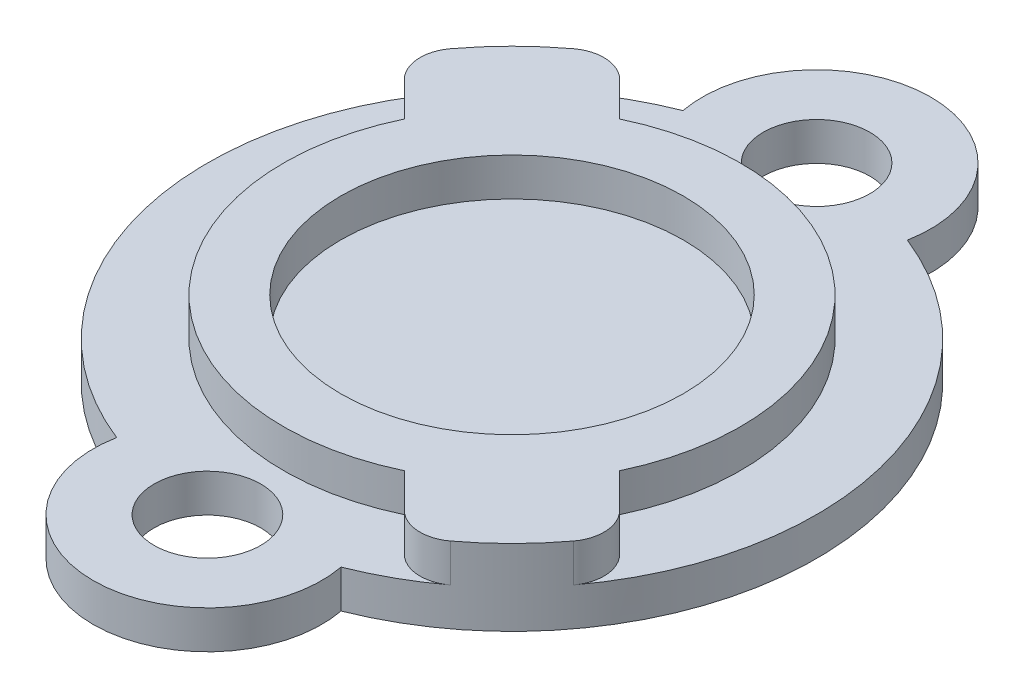
ISO-10303-21;
HEADER;
FILE_DESCRIPTION(('STEP AP214'),'2;1');
FILE_NAME('part.step','',(''),(''),'','','');
FILE_SCHEMA(('AUTOMOTIVE_DESIGN { 1 0 10303 214 1 1 1 1 }'));
ENDSEC;
DATA;
#1=APPLICATION_CONTEXT('core data for automotive mechanical design processes');
#2=APPLICATION_PROTOCOL_DEFINITION('international standard','automotive_design',2000,#1);
#3=PRODUCT_CONTEXT('',#1,'mechanical');
#4=PRODUCT('Part','Part','',(#3));
#5=PRODUCT_RELATED_PRODUCT_CATEGORY('part','',(#4));
#6=PRODUCT_DEFINITION_FORMATION('','',#4);
#7=PRODUCT_DEFINITION_CONTEXT('part definition',#1,'design');
#8=PRODUCT_DEFINITION('design','',#6,#7);
#9=PRODUCT_DEFINITION_SHAPE('','',#8);
#10=(LENGTH_UNIT() NAMED_UNIT(*) SI_UNIT(.MILLI.,.METRE.));
#11=(NAMED_UNIT(*) PLANE_ANGLE_UNIT() SI_UNIT($,.RADIAN.));
#12=(NAMED_UNIT(*) SI_UNIT($,.STERADIAN.) SOLID_ANGLE_UNIT());
#13=UNCERTAINTY_MEASURE_WITH_UNIT(LENGTH_MEASURE(1.E-05),#10,'distance_accuracy_value','');
#14=(GEOMETRIC_REPRESENTATION_CONTEXT(3) GLOBAL_UNCERTAINTY_ASSIGNED_CONTEXT((#13)) GLOBAL_UNIT_ASSIGNED_CONTEXT((#10,
#11,#12)) REPRESENTATION_CONTEXT('',''));
#15=CARTESIAN_POINT('',(0.,0.,0.));
#16=DIRECTION('',(0.,0.,1.));
#17=DIRECTION('',(1.,0.,0.));
#18=AXIS2_PLACEMENT_3D('',#15,#16,#17);
#19=CARTESIAN_POINT('',(-5.6060862667529,0.,-4.19187270437981));
#20=DIRECTION('',(0.,1.,0.));
#21=DIRECTION('',(-0.997432533711125,0.,0.0716124339385723));
#22=AXIS2_PLACEMENT_3D('',#19,#20,#21);
#23=CYLINDRICAL_SURFACE('',#22,1.);
#24=CARTESIAN_POINT('',(-5.6060862667529,2.,-4.19187270437981));
#25=DIRECTION('',(0.,-1.,0.));
#26=DIRECTION('',(-0.997432533711125,0.,0.0716124339385723));
#27=AXIS2_PLACEMENT_3D('',#24,#25,#26);
#28=CIRCLE('',#27,1.);
#29=CARTESIAN_POINT('',(-6.31319304793945,2.,-3.48476592319326));
#30=VERTEX_POINT('',#29);
#31=CARTESIAN_POINT('',(-6.40695573343189,2.,-4.79071166214835));
#32=VERTEX_POINT('',#31);
#33=EDGE_CURVE('E11',#30,#32,#28,.T.);
#34=ORIENTED_EDGE('',*,*,#33,.T.);
#35=DIRECTION('',(0.,-1.,0.));
#36=VECTOR('',#35,1.);
#37=CARTESIAN_POINT('',(-6.40695573343189,0.,-4.79071166214835));
#38=LINE('',#37,#36);
#39=CARTESIAN_POINT('',(-6.40695573343189,1.,-4.79071166214835));
#40=VERTEX_POINT('',#39);
#41=EDGE_CURVE('E28',#32,#40,#38,.T.);
#42=ORIENTED_EDGE('',*,*,#41,.T.);
#43=CARTESIAN_POINT('',(-5.6060862667529,1.,-4.19187270437981));
#44=DIRECTION('',(0.,1.,0.));
#45=DIRECTION('',(-0.997432533711125,0.,0.0716124339385723));
#46=AXIS2_PLACEMENT_3D('',#43,#44,#45);
#47=CIRCLE('',#46,1.);
#48=CARTESIAN_POINT('',(-6.31319304793945,1.,-3.48476592319326));
#49=VERTEX_POINT('',#48);
#50=EDGE_CURVE('E203',#40,#49,#47,.T.);
#51=ORIENTED_EDGE('',*,*,#50,.T.);
#52=DIRECTION('',(0.,1.,0.));
#53=VECTOR('',#52,1.);
#54=CARTESIAN_POINT('',(-6.31319304793945,0.,-3.48476592319326));
#55=LINE('',#54,#53);
#56=EDGE_CURVE('E283',#49,#30,#55,.T.);
#57=ORIENTED_EDGE('',*,*,#56,.T.);
#58=EDGE_LOOP('',(#34,#42,#51,#57));
#59=FACE_BOUND('',#58,.T.);
#60=ADVANCED_FACE('F17',(#59),#23,.T.);
#61=CARTESIAN_POINT('',(-6.89143913742476,1.,-4.06301201267857));
#62=DIRECTION('',(-0.707106781186547,0.,0.707106781186548));
#63=DIRECTION('',(0.,1.,0.));
#64=AXIS2_PLACEMENT_3D('',#61,#62,#63);
#65=PLANE('',#64);
#66=ORIENTED_EDGE('',*,*,#56,.F.);
#67=DIRECTION('',(-0.707106781186548,0.,-0.707106781186547));
#68=VECTOR('',#67,1.);
#69=CARTESIAN_POINT('',(-4.15282634989892,1.,-1.32439922515274));
#70=LINE('',#69,#68);
#71=CARTESIAN_POINT('',(-5.4142135623731,1.,-2.58578643762691));
#72=VERTEX_POINT('',#71);
#73=EDGE_CURVE('E205',#72,#49,#70,.T.);
#74=ORIENTED_EDGE('',*,*,#73,.F.);
#75=DIRECTION('',(0.,1.,0.));
#76=VECTOR('',#75,1.);
#77=CARTESIAN_POINT('',(-5.4142135623731,1.,-2.58578643762691));
#78=LINE('',#77,#76);
#79=CARTESIAN_POINT('',(-5.4142135623731,2.,-2.58578643762691));
#80=VERTEX_POINT('',#79);
#81=EDGE_CURVE('E21',#72,#80,#78,.T.);
#82=ORIENTED_EDGE('',*,*,#81,.T.);
#83=DIRECTION('',(0.707106781186548,0.,0.707106781186547));
#84=VECTOR('',#83,1.);
#85=CARTESIAN_POINT('',(-7.07106781186548,2.,-4.24264068711929));
#86=LINE('',#85,#84);
#87=EDGE_CURVE('E254',#30,#80,#86,.T.);
#88=ORIENTED_EDGE('',*,*,#87,.F.);
#89=EDGE_LOOP('',(#66,#74,#82,#88));
#90=FACE_BOUND('',#89,.T.);
#91=ADVANCED_FACE('F455',(#90),#65,.T.);
#92=CARTESIAN_POINT('',(-4.19187270437981,0.,-5.60608626675291));
#93=DIRECTION('',(0.,1.,0.));
#94=DIRECTION('',(0.071612433938573,0.,-0.997432533711125));
#95=AXIS2_PLACEMENT_3D('',#92,#93,#94);
#96=CYLINDRICAL_SURFACE('',#95,1.);
#97=CARTESIAN_POINT('',(-4.19187270437981,2.,-5.60608626675291));
#98=DIRECTION('',(0.,-1.,0.));
#99=DIRECTION('',(0.071612433938573,0.,-0.997432533711125));
#100=AXIS2_PLACEMENT_3D('',#97,#98,#99);
#101=CIRCLE('',#100,1.);
#102=CARTESIAN_POINT('',(-4.79071166214835,2.,-6.40695573343189));
#103=VERTEX_POINT('',#102);
#104=CARTESIAN_POINT('',(-3.48476592319326,2.,-6.31319304793945));
#105=VERTEX_POINT('',#104);
#106=EDGE_CURVE('E295',#103,#105,#101,.T.);
#107=ORIENTED_EDGE('',*,*,#106,.T.);
#108=DIRECTION('',(0.,-1.,0.));
#109=VECTOR('',#108,1.);
#110=CARTESIAN_POINT('',(-3.48476592319326,0.,-6.31319304793945));
#111=LINE('',#110,#109);
#112=CARTESIAN_POINT('',(-3.48476592319326,1.,-6.31319304793945));
#113=VERTEX_POINT('',#112);
#114=EDGE_CURVE('E297',#105,#113,#111,.T.);
#115=ORIENTED_EDGE('',*,*,#114,.T.);
#116=CARTESIAN_POINT('',(-4.19187270437981,1.,-5.60608626675291));
#117=DIRECTION('',(0.,1.,0.));
#118=DIRECTION('',(0.071612433938573,0.,-0.997432533711125));
#119=AXIS2_PLACEMENT_3D('',#116,#117,#118);
#120=CIRCLE('',#119,1.);
#121=CARTESIAN_POINT('',(-4.79071166214835,1.,-6.40695573343189));
#122=VERTEX_POINT('',#121);
#123=EDGE_CURVE('E304',#113,#122,#120,.T.);
#124=ORIENTED_EDGE('',*,*,#123,.T.);
#125=DIRECTION('',(0.,1.,0.));
#126=VECTOR('',#125,1.);
#127=CARTESIAN_POINT('',(-4.79071166214835,0.,-6.40695573343189));
#128=LINE('',#127,#126);
#129=EDGE_CURVE('E91',#122,#103,#128,.T.);
#130=ORIENTED_EDGE('',*,*,#129,.T.);
#131=EDGE_LOOP('',(#107,#115,#124,#130));
#132=FACE_BOUND('',#131,.T.);
#133=ADVANCED_FACE('F461',(#132),#96,.T.);
#134=CARTESIAN_POINT('',(0.,0.,0.));
#135=DIRECTION('',(0.,1.,0.));
#136=DIRECTION('',(-1.,0.,0.));
#137=AXIS2_PLACEMENT_3D('',#134,#135,#136);
#138=CYLINDRICAL_SURFACE('',#137,8.);
#139=ORIENTED_EDGE('',*,*,#41,.F.);
#140=CARTESIAN_POINT('',(0.,2.,0.));
#141=DIRECTION('',(0.,1.,0.));
#142=DIRECTION('',(-0.368349226066446,0.,-0.9296875));
#143=AXIS2_PLACEMENT_3D('',#140,#141,#142);
#144=CIRCLE('',#143,8.);
#145=EDGE_CURVE('E506',#103,#32,#144,.T.);
#146=ORIENTED_EDGE('',*,*,#145,.F.);
#147=ORIENTED_EDGE('',*,*,#129,.F.);
#148=CARTESIAN_POINT('',(0.,1.,0.));
#149=DIRECTION('',(0.,1.,0.));
#150=DIRECTION('',(-1.,0.,0.));
#151=AXIS2_PLACEMENT_3D('',#148,#149,#150);
#152=CIRCLE('',#151,8.);
#153=CARTESIAN_POINT('',(-2.94679380853157,1.,-7.4375));
#154=VERTEX_POINT('',#153);
#155=EDGE_CURVE('E280',#154,#122,#152,.T.);
#156=ORIENTED_EDGE('',*,*,#155,.F.);
#157=DIRECTION('',(0.,1.,0.));
#158=VECTOR('',#157,1.);
#159=CARTESIAN_POINT('',(-2.94679380853157,0.,-7.4375));
#160=LINE('',#159,#158);
#161=CARTESIAN_POINT('',(-2.94679380853157,0.,-7.4375));
#162=VERTEX_POINT('',#161);
#163=EDGE_CURVE('E276',#162,#154,#160,.T.);
#164=ORIENTED_EDGE('',*,*,#163,.F.);
#165=CARTESIAN_POINT('',(0.,0.,0.));
#166=DIRECTION('',(0.,1.,0.));
#167=DIRECTION('',(-1.,0.,0.));
#168=AXIS2_PLACEMENT_3D('',#165,#166,#167);
#169=CIRCLE('',#168,8.);
#170=CARTESIAN_POINT('',(-2.94679380853157,0.,7.4375));
#171=VERTEX_POINT('',#170);
#172=EDGE_CURVE('E210',#162,#171,#169,.T.);
#173=ORIENTED_EDGE('',*,*,#172,.T.);
#174=DIRECTION('',(0.,1.,0.));
#175=VECTOR('',#174,1.);
#176=CARTESIAN_POINT('',(-2.94679380853157,0.,7.4375));
#177=LINE('',#176,#175);
#178=CARTESIAN_POINT('',(-2.94679380853157,1.,7.4375));
#179=VERTEX_POINT('',#178);
#180=EDGE_CURVE('E207',#171,#179,#177,.T.);
#181=ORIENTED_EDGE('',*,*,#180,.T.);
#182=CARTESIAN_POINT('',(0.,1.,0.));
#183=DIRECTION('',(0.,1.,0.));
#184=DIRECTION('',(-1.,0.,0.));
#185=AXIS2_PLACEMENT_3D('',#182,#183,#184);
#186=CIRCLE('',#185,8.);
#187=EDGE_CURVE('E195',#40,#179,#186,.T.);
#188=ORIENTED_EDGE('',*,*,#187,.F.);
#189=EDGE_LOOP('',(#139,#146,#147,#156,#164,#173,#181,#188));
#190=FACE_BOUND('',#189,.T.);
#191=ADVANCED_FACE('F208',(#190),#138,.T.);
#192=CARTESIAN_POINT('',(5.60608626675291,0.,4.19187270437981));
#193=DIRECTION('',(0.,1.,0.));
#194=DIRECTION('',(0.997432533711125,0.,-0.0716124339385737));
#195=AXIS2_PLACEMENT_3D('',#192,#193,#194);
#196=CYLINDRICAL_SURFACE('',#195,1.);
#197=CARTESIAN_POINT('',(5.60608626675291,2.,4.19187270437981));
#198=DIRECTION('',(0.,-1.,0.));
#199=DIRECTION('',(0.997432533711125,0.,-0.0716124339385737));
#200=AXIS2_PLACEMENT_3D('',#197,#198,#199);
#201=CIRCLE('',#200,1.);
#202=CARTESIAN_POINT('',(6.31319304793946,2.,3.48476592319326));
#203=VERTEX_POINT('',#202);
#204=CARTESIAN_POINT('',(6.40695573343189,2.,4.79071166214835));
#205=VERTEX_POINT('',#204);
#206=EDGE_CURVE('E215',#203,#205,#201,.T.);
#207=ORIENTED_EDGE('',*,*,#206,.T.);
#208=DIRECTION('',(0.,-1.,0.));
#209=VECTOR('',#208,1.);
#210=CARTESIAN_POINT('',(6.40695573343189,0.,4.79071166214835));
#211=LINE('',#210,#209);
#212=CARTESIAN_POINT('',(6.40695573343189,1.,4.79071166214835));
#213=VERTEX_POINT('',#212);
#214=EDGE_CURVE('E356',#205,#213,#211,.T.);
#215=ORIENTED_EDGE('',*,*,#214,.T.);
#216=CARTESIAN_POINT('',(5.60608626675291,1.,4.19187270437981));
#217=DIRECTION('',(0.,1.,0.));
#218=DIRECTION('',(0.997432533711125,0.,-0.0716124339385737));
#219=AXIS2_PLACEMENT_3D('',#216,#217,#218);
#220=CIRCLE('',#219,1.);
#221=CARTESIAN_POINT('',(6.31319304793946,1.,3.48476592319326));
#222=VERTEX_POINT('',#221);
#223=EDGE_CURVE('E401',#213,#222,#220,.T.);
#224=ORIENTED_EDGE('',*,*,#223,.T.);
#225=DIRECTION('',(0.,1.,0.));
#226=VECTOR('',#225,1.);
#227=CARTESIAN_POINT('',(6.31319304793946,0.,3.48476592319326));
#228=LINE('',#227,#226);
#229=EDGE_CURVE('E368',#222,#203,#228,.T.);
#230=ORIENTED_EDGE('',*,*,#229,.T.);
#231=EDGE_LOOP('',(#207,#215,#224,#230));
#232=FACE_BOUND('',#231,.T.);
#233=ADVANCED_FACE('F403',(#232),#196,.T.);
#234=CARTESIAN_POINT('',(6.89143913742476,1.,4.06301201267856));
#235=DIRECTION('',(0.707106781186547,0.,-0.707106781186548));
#236=DIRECTION('',(0.,-1.,0.));
#237=AXIS2_PLACEMENT_3D('',#234,#235,#236);
#238=PLANE('',#237);
#239=ORIENTED_EDGE('',*,*,#229,.F.);
#240=DIRECTION('',(0.707106781186548,0.,0.707106781186547));
#241=VECTOR('',#240,1.);
#242=CARTESIAN_POINT('',(4.15282634989893,1.,1.32439922515273));
#243=LINE('',#242,#241);
#244=CARTESIAN_POINT('',(5.4142135623731,1.,2.5857864376269));
#245=VERTEX_POINT('',#244);
#246=EDGE_CURVE('E138',#245,#222,#243,.T.);
#247=ORIENTED_EDGE('',*,*,#246,.F.);
#248=DIRECTION('',(0.,1.,0.));
#249=VECTOR('',#248,1.);
#250=CARTESIAN_POINT('',(5.4142135623731,1.,2.5857864376269));
#251=LINE('',#250,#249);
#252=CARTESIAN_POINT('',(5.4142135623731,2.,2.5857864376269));
#253=VERTEX_POINT('',#252);
#254=EDGE_CURVE('E340',#245,#253,#251,.T.);
#255=ORIENTED_EDGE('',*,*,#254,.T.);
#256=DIRECTION('',(-0.707106781186548,0.,-0.707106781186547));
#257=VECTOR('',#256,1.);
#258=CARTESIAN_POINT('',(7.07106781186548,2.,4.24264068711928));
#259=LINE('',#258,#257);
#260=EDGE_CURVE('E153',#203,#253,#259,.T.);
#261=ORIENTED_EDGE('',*,*,#260,.F.);
#262=EDGE_LOOP('',(#239,#247,#255,#261));
#263=FACE_BOUND('',#262,.T.);
#264=ADVANCED_FACE('F404',(#263),#238,.T.);
#265=CARTESIAN_POINT('',(4.19187270437982,0.,5.6060862667529));
#266=DIRECTION('',(0.,1.,0.));
#267=DIRECTION('',(-0.0716124339385737,0.,0.997432533711125));
#268=AXIS2_PLACEMENT_3D('',#265,#266,#267);
#269=CYLINDRICAL_SURFACE('',#268,1.);
#270=CARTESIAN_POINT('',(4.19187270437982,2.,5.6060862667529));
#271=DIRECTION('',(0.,-1.,0.));
#272=DIRECTION('',(-0.0716124339385737,0.,0.997432533711125));
#273=AXIS2_PLACEMENT_3D('',#270,#271,#272);
#274=CIRCLE('',#273,1.);
#275=CARTESIAN_POINT('',(4.79071166214836,2.,6.40695573343188));
#276=VERTEX_POINT('',#275);
#277=CARTESIAN_POINT('',(3.48476592319327,2.,6.31319304793945));
#278=VERTEX_POINT('',#277);
#279=EDGE_CURVE('E315',#276,#278,#274,.T.);
#280=ORIENTED_EDGE('',*,*,#279,.T.);
#281=DIRECTION('',(0.,-1.,0.));
#282=VECTOR('',#281,1.);
#283=CARTESIAN_POINT('',(3.48476592319327,0.,6.31319304793945));
#284=LINE('',#283,#282);
#285=CARTESIAN_POINT('',(3.48476592319327,1.,6.31319304793945));
#286=VERTEX_POINT('',#285);
#287=EDGE_CURVE('E331',#278,#286,#284,.T.);
#288=ORIENTED_EDGE('',*,*,#287,.T.);
#289=CARTESIAN_POINT('',(4.19187270437982,1.,5.6060862667529));
#290=DIRECTION('',(0.,1.,0.));
#291=DIRECTION('',(-0.0716124339385737,0.,0.997432533711125));
#292=AXIS2_PLACEMENT_3D('',#289,#290,#291);
#293=CIRCLE('',#292,1.);
#294=CARTESIAN_POINT('',(4.79071166214836,1.,6.40695573343188));
#295=VERTEX_POINT('',#294);
#296=EDGE_CURVE('E334',#286,#295,#293,.T.);
#297=ORIENTED_EDGE('',*,*,#296,.T.);
#298=DIRECTION('',(0.,1.,0.));
#299=VECTOR('',#298,1.);
#300=CARTESIAN_POINT('',(4.79071166214836,0.,6.40695573343188));
#301=LINE('',#300,#299);
#302=EDGE_CURVE('E342',#295,#276,#301,.T.);
#303=ORIENTED_EDGE('',*,*,#302,.T.);
#304=EDGE_LOOP('',(#280,#288,#297,#303));
#305=FACE_BOUND('',#304,.T.);
#306=ADVANCED_FACE('F392',(#305),#269,.T.);
#307=CARTESIAN_POINT('',(0.,0.,0.));
#308=DIRECTION('',(0.,1.,0.));
#309=DIRECTION('',(1.,0.,0.));
#310=AXIS2_PLACEMENT_3D('',#307,#308,#309);
#311=CYLINDRICAL_SURFACE('',#310,8.);
#312=ORIENTED_EDGE('',*,*,#214,.F.);
#313=CARTESIAN_POINT('',(0.,2.,0.));
#314=DIRECTION('',(0.,1.,0.));
#315=DIRECTION('',(0.368349226066447,0.,0.9296875));
#316=AXIS2_PLACEMENT_3D('',#313,#314,#315);
#317=CIRCLE('',#316,8.);
#318=EDGE_CURVE('E247',#276,#205,#317,.T.);
#319=ORIENTED_EDGE('',*,*,#318,.F.);
#320=ORIENTED_EDGE('',*,*,#302,.F.);
#321=CARTESIAN_POINT('',(0.,1.,0.));
#322=DIRECTION('',(0.,1.,0.));
#323=DIRECTION('',(-1.,0.,0.));
#324=AXIS2_PLACEMENT_3D('',#321,#322,#323);
#325=CIRCLE('',#324,8.);
#326=CARTESIAN_POINT('',(2.94679380853157,1.,7.4375));
#327=VERTEX_POINT('',#326);
#328=EDGE_CURVE('E221',#327,#295,#325,.T.);
#329=ORIENTED_EDGE('',*,*,#328,.F.);
#330=DIRECTION('',(0.,1.,0.));
#331=VECTOR('',#330,1.);
#332=CARTESIAN_POINT('',(2.94679380853157,0.,7.4375));
#333=LINE('',#332,#331);
#334=CARTESIAN_POINT('',(2.94679380853157,0.,7.4375));
#335=VERTEX_POINT('',#334);
#336=EDGE_CURVE('E218',#335,#327,#333,.T.);
#337=ORIENTED_EDGE('',*,*,#336,.F.);
#338=CARTESIAN_POINT('',(0.,0.,0.));
#339=DIRECTION('',(0.,1.,0.));
#340=DIRECTION('',(-1.,0.,0.));
#341=AXIS2_PLACEMENT_3D('',#338,#339,#340);
#342=CIRCLE('',#341,8.);
#343=CARTESIAN_POINT('',(2.94679380853157,0.,-7.4375));
#344=VERTEX_POINT('',#343);
#345=EDGE_CURVE('E330',#335,#344,#342,.T.);
#346=ORIENTED_EDGE('',*,*,#345,.T.);
#347=DIRECTION('',(0.,1.,0.));
#348=VECTOR('',#347,1.);
#349=CARTESIAN_POINT('',(2.94679380853157,0.,-7.4375));
#350=LINE('',#349,#348);
#351=CARTESIAN_POINT('',(2.94679380853157,1.,-7.4375));
#352=VERTEX_POINT('',#351);
#353=EDGE_CURVE('E327',#344,#352,#350,.T.);
#354=ORIENTED_EDGE('',*,*,#353,.T.);
#355=CARTESIAN_POINT('',(0.,1.,0.));
#356=DIRECTION('',(0.,1.,0.));
#357=DIRECTION('',(-1.,0.,0.));
#358=AXIS2_PLACEMENT_3D('',#355,#356,#357);
#359=CIRCLE('',#358,8.);
#360=EDGE_CURVE('E234',#213,#352,#359,.T.);
#361=ORIENTED_EDGE('',*,*,#360,.F.);
#362=EDGE_LOOP('',(#312,#319,#320,#329,#337,#346,#354,#361));
#363=FACE_BOUND('',#362,.T.);
#364=ADVANCED_FACE('F395',(#363),#311,.T.);
#365=CARTESIAN_POINT('',(0.,1.,0.));
#366=DIRECTION('',(0.,1.,0.));
#367=DIRECTION('',(-1.,0.,0.));
#368=AXIS2_PLACEMENT_3D('',#365,#366,#367);
#369=CYLINDRICAL_SURFACE('',#368,4.5);
#370=CARTESIAN_POINT('',(0.,2.,0.));
#371=DIRECTION('',(0.,-1.,0.));
#372=DIRECTION('',(-1.,0.,0.));
#373=AXIS2_PLACEMENT_3D('',#370,#371,#372);
#374=CIRCLE('',#373,4.5);
#375=CARTESIAN_POINT('',(4.5,2.,0.));
#376=VERTEX_POINT('',#375);
#377=EDGE_CURVE('E233',#376,#376,#374,.T.);
#378=ORIENTED_EDGE('',*,*,#377,.F.);
#379=DIRECTION('',(0.,-1.,0.));
#380=VECTOR('',#379,1.);
#381=CARTESIAN_POINT('',(4.5,1.,0.));
#382=LINE('',#381,#380);
#383=CARTESIAN_POINT('',(4.5,1.,0.));
#384=VERTEX_POINT('',#383);
#385=EDGE_CURVE('E323',#376,#384,#382,.T.);
#386=ORIENTED_EDGE('',*,*,#385,.T.);
#387=CARTESIAN_POINT('',(0.,1.,0.));
#388=DIRECTION('',(0.,1.,0.));
#389=DIRECTION('',(-1.,0.,0.));
#390=AXIS2_PLACEMENT_3D('',#387,#388,#389);
#391=CIRCLE('',#390,4.5);
#392=EDGE_CURVE('E239',#384,#384,#391,.T.);
#393=ORIENTED_EDGE('',*,*,#392,.F.);
#394=ORIENTED_EDGE('',*,*,#385,.F.);
#395=EDGE_LOOP('',(#378,#386,#393,#394));
#396=FACE_BOUND('',#395,.T.);
#397=ADVANCED_FACE('F493',(#396),#369,.F.);
#398=CARTESIAN_POINT('',(0.,1.,0.));
#399=DIRECTION('',(0.,1.,0.));
#400=DIRECTION('',(1.,0.,0.));
#401=AXIS2_PLACEMENT_3D('',#398,#399,#400);
#402=CYLINDRICAL_SURFACE('',#401,6.);
#403=CARTESIAN_POINT('',(0.,1.,0.));
#404=DIRECTION('',(0.,-1.,0.));
#405=DIRECTION('',(1.,0.,0.));
#406=AXIS2_PLACEMENT_3D('',#403,#404,#405);
#407=CIRCLE('',#406,6.);
#408=CARTESIAN_POINT('',(-2.58578643762691,1.,-5.4142135623731));
#409=VERTEX_POINT('',#408);
#410=EDGE_CURVE('E294',#409,#245,#407,.T.);
#411=ORIENTED_EDGE('',*,*,#410,.F.);
#412=DIRECTION('',(0.,1.,0.));
#413=VECTOR('',#412,1.);
#414=CARTESIAN_POINT('',(-2.58578643762691,1.,-5.4142135623731));
#415=LINE('',#414,#413);
#416=CARTESIAN_POINT('',(-2.58578643762691,2.,-5.4142135623731));
#417=VERTEX_POINT('',#416);
#418=EDGE_CURVE('E253',#409,#417,#415,.T.);
#419=ORIENTED_EDGE('',*,*,#418,.T.);
#420=CARTESIAN_POINT('',(0.,2.,0.));
#421=DIRECTION('',(0.,1.,0.));
#422=DIRECTION('',(1.,0.,0.));
#423=AXIS2_PLACEMENT_3D('',#420,#421,#422);
#424=CIRCLE('',#423,6.);
#425=EDGE_CURVE('E248',#253,#417,#424,.T.);
#426=ORIENTED_EDGE('',*,*,#425,.F.);
#427=ORIENTED_EDGE('',*,*,#254,.F.);
#428=EDGE_LOOP('',(#411,#419,#426,#427));
#429=FACE_BOUND('',#428,.T.);
#430=ADVANCED_FACE('F409',(#429),#402,.T.);
#431=CARTESIAN_POINT('',(2.58578643762691,1.,5.41421356237309));
#432=DIRECTION('',(-0.707106781186547,0.,0.707106781186548));
#433=DIRECTION('',(0.,1.,0.));
#434=AXIS2_PLACEMENT_3D('',#431,#432,#433);
#435=PLANE('',#434);
#436=ORIENTED_EDGE('',*,*,#287,.F.);
#437=DIRECTION('',(0.707106781186548,0.,0.707106781186547));
#438=VECTOR('',#437,1.);
#439=CARTESIAN_POINT('',(-7.07106781186548,2.,-4.24264068711929));
#440=LINE('',#439,#438);
#441=CARTESIAN_POINT('',(2.58578643762691,2.,5.41421356237309));
#442=VERTEX_POINT('',#441);
#443=EDGE_CURVE('E366',#442,#278,#440,.T.);
#444=ORIENTED_EDGE('',*,*,#443,.F.);
#445=DIRECTION('',(0.,1.,0.));
#446=VECTOR('',#445,1.);
#447=CARTESIAN_POINT('',(2.58578643762691,1.,5.41421356237309));
#448=LINE('',#447,#446);
#449=CARTESIAN_POINT('',(2.58578643762691,1.,5.41421356237309));
#450=VERTEX_POINT('',#449);
#451=EDGE_CURVE('E249',#450,#442,#448,.T.);
#452=ORIENTED_EDGE('',*,*,#451,.F.);
#453=DIRECTION('',(-0.707106781186548,0.,-0.707106781186547));
#454=VECTOR('',#453,1.);
#455=CARTESIAN_POINT('',(0.58578643762691,1.,3.41421356237309));
#456=LINE('',#455,#454);
#457=EDGE_CURVE('E240',#286,#450,#456,.T.);
#458=ORIENTED_EDGE('',*,*,#457,.F.);
#459=EDGE_LOOP('',(#436,#444,#452,#458));
#460=FACE_BOUND('',#459,.T.);
#461=ADVANCED_FACE('F391',(#460),#435,.T.);
#462=CARTESIAN_POINT('',(0.,1.,0.));
#463=DIRECTION('',(0.,1.,0.));
#464=DIRECTION('',(-0.707106781186547,0.,0.707106781186548));
#465=AXIS2_PLACEMENT_3D('',#462,#463,#464);
#466=CYLINDRICAL_SURFACE('',#465,6.);
#467=CARTESIAN_POINT('',(0.,1.,0.));
#468=DIRECTION('',(0.,-1.,0.));
#469=DIRECTION('',(1.,0.,0.));
#470=AXIS2_PLACEMENT_3D('',#467,#468,#469);
#471=CIRCLE('',#470,6.);
#472=EDGE_CURVE('E244',#450,#72,#471,.T.);
#473=ORIENTED_EDGE('',*,*,#472,.F.);
#474=ORIENTED_EDGE('',*,*,#451,.T.);
#475=CARTESIAN_POINT('',(0.,2.,0.));
#476=DIRECTION('',(0.,1.,0.));
#477=DIRECTION('',(1.,0.,0.));
#478=AXIS2_PLACEMENT_3D('',#475,#476,#477);
#479=CIRCLE('',#478,6.);
#480=EDGE_CURVE('E326',#80,#442,#479,.T.);
#481=ORIENTED_EDGE('',*,*,#480,.F.);
#482=ORIENTED_EDGE('',*,*,#81,.F.);
#483=EDGE_LOOP('',(#473,#474,#481,#482));
#484=FACE_BOUND('',#483,.T.);
#485=ADVANCED_FACE('F387',(#484),#466,.T.);
#486=CARTESIAN_POINT('',(-2.58578643762691,1.,-5.4142135623731));
#487=DIRECTION('',(0.707106781186547,0.,-0.707106781186548));
#488=DIRECTION('',(0.,-1.,0.));
#489=AXIS2_PLACEMENT_3D('',#486,#487,#488);
#490=PLANE('',#489);
#491=ORIENTED_EDGE('',*,*,#114,.F.);
#492=DIRECTION('',(-0.707106781186548,0.,-0.707106781186547));
#493=VECTOR('',#492,1.);
#494=CARTESIAN_POINT('',(7.07106781186548,2.,4.24264068711928));
#495=LINE('',#494,#493);
#496=EDGE_CURVE('E231',#417,#105,#495,.T.);
#497=ORIENTED_EDGE('',*,*,#496,.F.);
#498=ORIENTED_EDGE('',*,*,#418,.F.);
#499=DIRECTION('',(0.707106781186548,0.,0.707106781186547));
#500=VECTOR('',#499,1.);
#501=CARTESIAN_POINT('',(-0.585786437626904,1.,-3.4142135623731));
#502=LINE('',#501,#500);
#503=EDGE_CURVE('E418',#113,#409,#502,.T.);
#504=ORIENTED_EDGE('',*,*,#503,.F.);
#505=EDGE_LOOP('',(#491,#497,#498,#504));
#506=FACE_BOUND('',#505,.T.);
#507=ADVANCED_FACE('F421',(#506),#490,.T.);
#508=CARTESIAN_POINT('',(0.,2.,0.));
#509=DIRECTION('',(0.,1.,0.));
#510=DIRECTION('',(1.,0.,0.));
#511=AXIS2_PLACEMENT_3D('',#508,#509,#510);
#512=PLANE('',#511);
#513=ORIENTED_EDGE('',*,*,#33,.F.);
#514=ORIENTED_EDGE('',*,*,#87,.T.);
#515=ORIENTED_EDGE('',*,*,#480,.T.);
#516=ORIENTED_EDGE('',*,*,#443,.T.);
#517=ORIENTED_EDGE('',*,*,#279,.F.);
#518=ORIENTED_EDGE('',*,*,#318,.T.);
#519=ORIENTED_EDGE('',*,*,#206,.F.);
#520=ORIENTED_EDGE('',*,*,#260,.T.);
#521=ORIENTED_EDGE('',*,*,#425,.T.);
#522=ORIENTED_EDGE('',*,*,#496,.T.);
#523=ORIENTED_EDGE('',*,*,#106,.F.);
#524=ORIENTED_EDGE('',*,*,#145,.T.);
#525=EDGE_LOOP('',(#513,#514,#515,#516,#517,#518,#519,#520,#521,#522,#523,#524));
#526=FACE_BOUND('',#525,.T.);
#527=ORIENTED_EDGE('',*,*,#377,.T.);
#528=EDGE_LOOP('',(#527));
#529=FACE_BOUND('',#528,.T.);
#530=ADVANCED_FACE('F379',(#526,#529),#512,.T.);
#531=CARTESIAN_POINT('',(0.,1.,0.));
#532=DIRECTION('',(0.,1.,0.));
#533=DIRECTION('',(1.,0.,0.));
#534=AXIS2_PLACEMENT_3D('',#531,#532,#533);
#535=PLANE('',#534);
#536=ORIENTED_EDGE('',*,*,#246,.T.);
#537=ORIENTED_EDGE('',*,*,#223,.F.);
#538=ORIENTED_EDGE('',*,*,#360,.T.);
#539=CARTESIAN_POINT('',(0.,1.,-8.));
#540=DIRECTION('',(0.,1.,0.));
#541=DIRECTION('',(-1.,0.,0.));
#542=AXIS2_PLACEMENT_3D('',#539,#540,#541);
#543=CIRCLE('',#542,3.);
#544=EDGE_CURVE('E288',#352,#154,#543,.T.);
#545=ORIENTED_EDGE('',*,*,#544,.T.);
#546=ORIENTED_EDGE('',*,*,#155,.T.);
#547=ORIENTED_EDGE('',*,*,#123,.F.);
#548=ORIENTED_EDGE('',*,*,#503,.T.);
#549=ORIENTED_EDGE('',*,*,#410,.T.);
#550=EDGE_LOOP('',(#536,#537,#538,#545,#546,#547,#548,#549));
#551=FACE_BOUND('',#550,.T.);
#552=CARTESIAN_POINT('',(0.,1.,-8.));
#553=DIRECTION('',(0.,-1.,0.));
#554=DIRECTION('',(1.,0.,0.));
#555=AXIS2_PLACEMENT_3D('',#552,#553,#554);
#556=CIRCLE('',#555,1.4);
#557=CARTESIAN_POINT('',(-1.4,1.,-8.));
#558=VERTEX_POINT('',#557);
#559=EDGE_CURVE('E243',#558,#558,#556,.T.);
#560=ORIENTED_EDGE('',*,*,#559,.T.);
#561=EDGE_LOOP('',(#560));
#562=FACE_BOUND('',#561,.T.);
#563=ADVANCED_FACE('F422',(#551,#562),#535,.T.);
#564=CARTESIAN_POINT('',(0.,1.,0.));
#565=DIRECTION('',(0.,1.,0.));
#566=DIRECTION('',(1.,0.,0.));
#567=AXIS2_PLACEMENT_3D('',#564,#565,#566);
#568=PLANE('',#567);
#569=ORIENTED_EDGE('',*,*,#457,.T.);
#570=ORIENTED_EDGE('',*,*,#472,.T.);
#571=ORIENTED_EDGE('',*,*,#73,.T.);
#572=ORIENTED_EDGE('',*,*,#50,.F.);
#573=ORIENTED_EDGE('',*,*,#187,.T.);
#574=CARTESIAN_POINT('',(0.,1.,8.));
#575=DIRECTION('',(0.,1.,0.));
#576=DIRECTION('',(-1.,0.,0.));
#577=AXIS2_PLACEMENT_3D('',#574,#575,#576);
#578=CIRCLE('',#577,3.);
#579=EDGE_CURVE('E200',#179,#327,#578,.T.);
#580=ORIENTED_EDGE('',*,*,#579,.T.);
#581=ORIENTED_EDGE('',*,*,#328,.T.);
#582=ORIENTED_EDGE('',*,*,#296,.F.);
#583=EDGE_LOOP('',(#569,#570,#571,#572,#573,#580,#581,#582));
#584=FACE_BOUND('',#583,.T.);
#585=CARTESIAN_POINT('',(0.,1.,8.));
#586=DIRECTION('',(0.,-1.,0.));
#587=DIRECTION('',(1.,0.,0.));
#588=AXIS2_PLACEMENT_3D('',#585,#586,#587);
#589=CIRCLE('',#588,1.4);
#590=CARTESIAN_POINT('',(-1.4,1.,8.));
#591=VERTEX_POINT('',#590);
#592=EDGE_CURVE('E227',#591,#591,#589,.T.);
#593=ORIENTED_EDGE('',*,*,#592,.T.);
#594=EDGE_LOOP('',(#593));
#595=FACE_BOUND('',#594,.T.);
#596=ADVANCED_FACE('F19',(#584,#595),#568,.T.);
#597=CARTESIAN_POINT('',(0.,0.,-8.));
#598=DIRECTION('',(0.,1.,0.));
#599=DIRECTION('',(1.,0.,0.));
#600=AXIS2_PLACEMENT_3D('',#597,#598,#599);
#601=CYLINDRICAL_SURFACE('',#600,1.4);
#602=ORIENTED_EDGE('',*,*,#559,.F.);
#603=DIRECTION('',(0.,-1.,0.));
#604=VECTOR('',#603,1.);
#605=CARTESIAN_POINT('',(-1.4,0.,-8.));
#606=LINE('',#605,#604);
#607=CARTESIAN_POINT('',(-1.4,0.,-8.));
#608=VERTEX_POINT('',#607);
#609=EDGE_CURVE('E266',#558,#608,#606,.T.);
#610=ORIENTED_EDGE('',*,*,#609,.T.);
#611=CARTESIAN_POINT('',(0.,0.,-8.));
#612=DIRECTION('',(0.,-1.,0.));
#613=DIRECTION('',(1.,0.,0.));
#614=AXIS2_PLACEMENT_3D('',#611,#612,#613);
#615=CIRCLE('',#614,1.4);
#616=EDGE_CURVE('E258',#608,#608,#615,.T.);
#617=ORIENTED_EDGE('',*,*,#616,.T.);
#618=ORIENTED_EDGE('',*,*,#609,.F.);
#619=EDGE_LOOP('',(#602,#610,#617,#618));
#620=FACE_BOUND('',#619,.T.);
#621=ADVANCED_FACE('F442',(#620),#601,.F.);
#622=CARTESIAN_POINT('',(0.,0.,8.));
#623=DIRECTION('',(0.,1.,0.));
#624=DIRECTION('',(1.,0.,0.));
#625=AXIS2_PLACEMENT_3D('',#622,#623,#624);
#626=CYLINDRICAL_SURFACE('',#625,1.4);
#627=ORIENTED_EDGE('',*,*,#592,.F.);
#628=DIRECTION('',(0.,-1.,0.));
#629=VECTOR('',#628,1.);
#630=CARTESIAN_POINT('',(-1.4,0.,8.));
#631=LINE('',#630,#629);
#632=CARTESIAN_POINT('',(-1.4,0.,8.));
#633=VERTEX_POINT('',#632);
#634=EDGE_CURVE('E255',#591,#633,#631,.T.);
#635=ORIENTED_EDGE('',*,*,#634,.T.);
#636=CARTESIAN_POINT('',(0.,0.,8.));
#637=DIRECTION('',(0.,-1.,0.));
#638=DIRECTION('',(1.,0.,0.));
#639=AXIS2_PLACEMENT_3D('',#636,#637,#638);
#640=CIRCLE('',#639,1.4);
#641=EDGE_CURVE('E259',#633,#633,#640,.T.);
#642=ORIENTED_EDGE('',*,*,#641,.T.);
#643=ORIENTED_EDGE('',*,*,#634,.F.);
#644=EDGE_LOOP('',(#627,#635,#642,#643));
#645=FACE_BOUND('',#644,.T.);
#646=ADVANCED_FACE('F439',(#645),#626,.F.);
#647=CARTESIAN_POINT('',(0.,0.,-8.));
#648=DIRECTION('',(0.,1.,0.));
#649=DIRECTION('',(0.,0.,-1.));
#650=AXIS2_PLACEMENT_3D('',#647,#648,#649);
#651=CYLINDRICAL_SURFACE('',#650,3.);
#652=CARTESIAN_POINT('',(0.,0.,-8.));
#653=DIRECTION('',(0.,1.,0.));
#654=DIRECTION('',(-1.,0.,0.));
#655=AXIS2_PLACEMENT_3D('',#652,#653,#654);
#656=CIRCLE('',#655,3.);
#657=EDGE_CURVE('E269',#344,#162,#656,.T.);
#658=ORIENTED_EDGE('',*,*,#657,.T.);
#659=ORIENTED_EDGE('',*,*,#163,.T.);
#660=ORIENTED_EDGE('',*,*,#544,.F.);
#661=ORIENTED_EDGE('',*,*,#353,.F.);
#662=EDGE_LOOP('',(#658,#659,#660,#661));
#663=FACE_BOUND('',#662,.T.);
#664=ADVANCED_FACE('F441',(#663),#651,.T.);
#665=CARTESIAN_POINT('',(0.,0.,8.));
#666=DIRECTION('',(0.,1.,0.));
#667=DIRECTION('',(0.,0.,1.));
#668=AXIS2_PLACEMENT_3D('',#665,#666,#667);
#669=CYLINDRICAL_SURFACE('',#668,3.);
#670=CARTESIAN_POINT('',(0.,0.,8.));
#671=DIRECTION('',(0.,1.,0.));
#672=DIRECTION('',(-1.,0.,0.));
#673=AXIS2_PLACEMENT_3D('',#670,#671,#672);
#674=CIRCLE('',#673,3.);
#675=EDGE_CURVE('E238',#171,#335,#674,.T.);
#676=ORIENTED_EDGE('',*,*,#675,.T.);
#677=ORIENTED_EDGE('',*,*,#336,.T.);
#678=ORIENTED_EDGE('',*,*,#579,.F.);
#679=ORIENTED_EDGE('',*,*,#180,.F.);
#680=EDGE_LOOP('',(#676,#677,#678,#679));
#681=FACE_BOUND('',#680,.T.);
#682=ADVANCED_FACE('F217',(#681),#669,.T.);
#683=CARTESIAN_POINT('',(0.,1.,0.));
#684=DIRECTION('',(0.,1.,0.));
#685=DIRECTION('',(1.,0.,0.));
#686=AXIS2_PLACEMENT_3D('',#683,#684,#685);
#687=PLANE('',#686);
#688=ORIENTED_EDGE('',*,*,#392,.T.);
#689=EDGE_LOOP('',(#688));
#690=FACE_BOUND('',#689,.T.);
#691=ADVANCED_FACE('F480',(#690),#687,.T.);
#692=CARTESIAN_POINT('',(0.,0.,0.));
#693=DIRECTION('',(0.,1.,0.));
#694=DIRECTION('',(1.,0.,0.));
#695=AXIS2_PLACEMENT_3D('',#692,#693,#694);
#696=PLANE('',#695);
#697=ORIENTED_EDGE('',*,*,#172,.F.);
#698=ORIENTED_EDGE('',*,*,#657,.F.);
#699=ORIENTED_EDGE('',*,*,#345,.F.);
#700=ORIENTED_EDGE('',*,*,#675,.F.);
#701=EDGE_LOOP('',(#697,#698,#699,#700));
#702=FACE_BOUND('',#701,.T.);
#703=ORIENTED_EDGE('',*,*,#641,.F.);
#704=EDGE_LOOP('',(#703));
#705=FACE_BOUND('',#704,.T.);
#706=ORIENTED_EDGE('',*,*,#616,.F.);
#707=EDGE_LOOP('',(#706));
#708=FACE_BOUND('',#707,.T.);
#709=ADVANCED_FACE('F483',(#702,#705,#708),#696,.F.);
#710=CLOSED_SHELL('',(#60,#91,#133,#191,#233,#264,#306,#364,#397,#430,#461,#485,#507,#530,#563,
#596,#621,#646,#664,#682,#691,#709));
#711=MANIFOLD_SOLID_BREP('B1',#710);
#712=ADVANCED_BREP_SHAPE_REPRESENTATION('',(#18,#711),#14);
#713=SHAPE_DEFINITION_REPRESENTATION(#9,#712);
ENDSEC;
END-ISO-10303-21;
